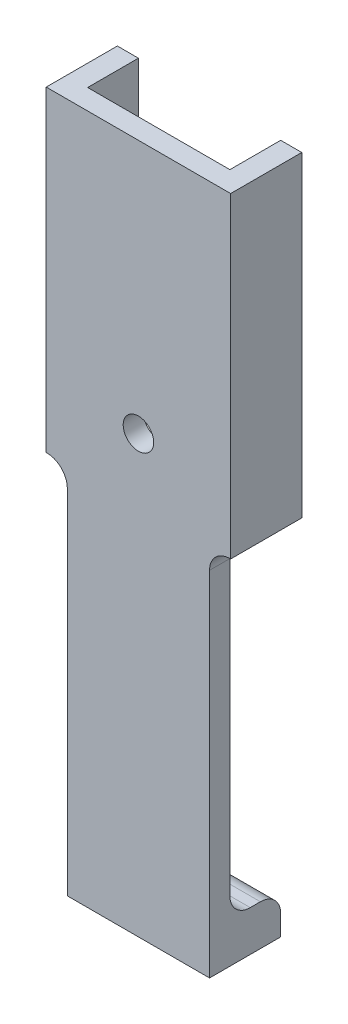
ISO-10303-21;
HEADER;
FILE_DESCRIPTION(('STEP AP214'),'2;1');
FILE_NAME('part.step','',(''),(''),'','','');
FILE_SCHEMA(('AUTOMOTIVE_DESIGN { 1 0 10303 214 1 1 1 1 }'));
ENDSEC;
DATA;
#1=APPLICATION_CONTEXT('core data for automotive mechanical design processes');
#2=APPLICATION_PROTOCOL_DEFINITION('international standard','automotive_design',2000,#1);
#3=PRODUCT_CONTEXT('',#1,'mechanical');
#4=PRODUCT('Part','Part','',(#3));
#5=PRODUCT_RELATED_PRODUCT_CATEGORY('part','',(#4));
#6=PRODUCT_DEFINITION_FORMATION('','',#4);
#7=PRODUCT_DEFINITION_CONTEXT('part definition',#1,'design');
#8=PRODUCT_DEFINITION('design','',#6,#7);
#9=PRODUCT_DEFINITION_SHAPE('','',#8);
#10=(LENGTH_UNIT() NAMED_UNIT(*) SI_UNIT(.MILLI.,.METRE.));
#11=(NAMED_UNIT(*) PLANE_ANGLE_UNIT() SI_UNIT($,.RADIAN.));
#12=(NAMED_UNIT(*) SI_UNIT($,.STERADIAN.) SOLID_ANGLE_UNIT());
#13=UNCERTAINTY_MEASURE_WITH_UNIT(LENGTH_MEASURE(1.E-05),#10,'distance_accuracy_value','');
#14=(GEOMETRIC_REPRESENTATION_CONTEXT(3) GLOBAL_UNCERTAINTY_ASSIGNED_CONTEXT((#13)) GLOBAL_UNIT_ASSIGNED_CONTEXT((#10,
#11,#12)) REPRESENTATION_CONTEXT('',''));
#15=CARTESIAN_POINT('',(0.,0.,0.));
#16=DIRECTION('',(0.,0.,1.));
#17=DIRECTION('',(1.,0.,0.));
#18=AXIS2_PLACEMENT_3D('',#15,#16,#17);
#19=CARTESIAN_POINT('',(-7.,0.,2.));
#20=DIRECTION('',(1.,0.,0.));
#21=DIRECTION('',(0.,1.,0.));
#22=AXIS2_PLACEMENT_3D('',#19,#20,#21);
#23=PLANE('',#22);
#24=DIRECTION('',(0.,-1.,0.));
#25=VECTOR('',#24,1.);
#26=CARTESIAN_POINT('',(-7.,0.,2.));
#27=LINE('',#26,#25);
#28=CARTESIAN_POINT('',(-7.,-17.65,2.));
#29=VERTEX_POINT('',#28);
#30=CARTESIAN_POINT('',(-7.,-52.4,2.));
#31=VERTEX_POINT('',#30);
#32=EDGE_CURVE('E306',#29,#31,#27,.T.);
#33=ORIENTED_EDGE('',*,*,#32,.F.);
#34=DIRECTION('',(0.,0.,1.));
#35=VECTOR('',#34,1.);
#36=CARTESIAN_POINT('',(-7.,-17.65,0.));
#37=LINE('',#36,#35);
#38=CARTESIAN_POINT('',(-7.,-17.65,0.));
#39=VERTEX_POINT('',#38);
#40=EDGE_CURVE('E364',#29,#39,#37,.F.);
#41=ORIENTED_EDGE('',*,*,#40,.T.);
#42=DIRECTION('',(0.,-1.,0.));
#43=VECTOR('',#42,1.);
#44=CARTESIAN_POINT('',(-7.,0.,0.));
#45=LINE('',#44,#43);
#46=CARTESIAN_POINT('',(-7.00000000000001,-46.4,0.));
#47=VERTEX_POINT('',#46);
#48=EDGE_CURVE('E325',#39,#47,#45,.T.);
#49=ORIENTED_EDGE('',*,*,#48,.T.);
#50=CARTESIAN_POINT('',(-7.00000000000001,-46.4,-2.));
#51=DIRECTION('',(1.,0.,0.));
#52=DIRECTION('',(0.,1.,0.));
#53=AXIS2_PLACEMENT_3D('',#50,#51,#52);
#54=CIRCLE('',#53,2.);
#55=CARTESIAN_POINT('',(-7.,-48.4,-2.));
#56=VERTEX_POINT('',#55);
#57=EDGE_CURVE('E11',#47,#56,#54,.T.);
#58=ORIENTED_EDGE('',*,*,#57,.T.);
#59=DIRECTION('',(0.,0.,1.));
#60=VECTOR('',#59,1.);
#61=CARTESIAN_POINT('',(-7.,-48.4,-5.));
#62=LINE('',#61,#60);
#63=CARTESIAN_POINT('',(-7.,-48.4,-3.));
#64=VERTEX_POINT('',#63);
#65=EDGE_CURVE('E299',#64,#56,#62,.T.);
#66=ORIENTED_EDGE('',*,*,#65,.F.);
#67=CARTESIAN_POINT('',(-7.00000000000001,-50.4,-3.));
#68=DIRECTION('',(1.,0.,0.));
#69=DIRECTION('',(0.,1.,0.));
#70=AXIS2_PLACEMENT_3D('',#67,#68,#69);
#71=CIRCLE('',#70,2.);
#72=CARTESIAN_POINT('',(-7.,-50.4,-5.));
#73=VERTEX_POINT('',#72);
#74=EDGE_CURVE('E361',#64,#73,#71,.F.);
#75=ORIENTED_EDGE('',*,*,#74,.T.);
#76=DIRECTION('',(0.,1.,0.));
#77=VECTOR('',#76,1.);
#78=CARTESIAN_POINT('',(-7.,-48.4,-5.));
#79=LINE('',#78,#77);
#80=CARTESIAN_POINT('',(-7.,-52.4,-5.));
#81=VERTEX_POINT('',#80);
#82=EDGE_CURVE('E291',#81,#73,#79,.T.);
#83=ORIENTED_EDGE('',*,*,#82,.F.);
#84=DIRECTION('',(0.,0.,-1.));
#85=VECTOR('',#84,1.);
#86=CARTESIAN_POINT('',(-7.,-52.4,2.));
#87=LINE('',#86,#85);
#88=EDGE_CURVE('E341',#31,#81,#87,.T.);
#89=ORIENTED_EDGE('',*,*,#88,.F.);
#90=EDGE_LOOP('',(#33,#41,#49,#58,#66,#75,#83,#89));
#91=FACE_BOUND('',#90,.T.);
#92=ADVANCED_FACE('F44',(#91),#23,.F.);
#93=CARTESIAN_POINT('',(7.,0.,2.));
#94=DIRECTION('',(-1.,0.,0.));
#95=DIRECTION('',(0.,-1.,0.));
#96=AXIS2_PLACEMENT_3D('',#93,#94,#95);
#97=PLANE('',#96);
#98=DIRECTION('',(0.,1.,0.));
#99=VECTOR('',#98,1.);
#100=CARTESIAN_POINT('',(7.,0.,0.));
#101=LINE('',#100,#99);
#102=CARTESIAN_POINT('',(6.99999999999999,-46.4,0.));
#103=VERTEX_POINT('',#102);
#104=CARTESIAN_POINT('',(7.,-17.65,0.));
#105=VERTEX_POINT('',#104);
#106=EDGE_CURVE('E331',#103,#105,#101,.T.);
#107=ORIENTED_EDGE('',*,*,#106,.T.);
#108=DIRECTION('',(0.,0.,-1.));
#109=VECTOR('',#108,1.);
#110=CARTESIAN_POINT('',(7.,-17.65,2.));
#111=LINE('',#110,#109);
#112=CARTESIAN_POINT('',(7.,-17.65,2.));
#113=VERTEX_POINT('',#112);
#114=EDGE_CURVE('E354',#105,#113,#111,.F.);
#115=ORIENTED_EDGE('',*,*,#114,.T.);
#116=DIRECTION('',(0.,1.,0.));
#117=VECTOR('',#116,1.);
#118=CARTESIAN_POINT('',(7.,0.,2.));
#119=LINE('',#118,#117);
#120=CARTESIAN_POINT('',(7.00000000000001,-52.4,2.));
#121=VERTEX_POINT('',#120);
#122=EDGE_CURVE('E313',#121,#113,#119,.T.);
#123=ORIENTED_EDGE('',*,*,#122,.F.);
#124=DIRECTION('',(0.,0.,-1.));
#125=VECTOR('',#124,1.);
#126=CARTESIAN_POINT('',(7.00000000000001,-52.4,2.));
#127=LINE('',#126,#125);
#128=CARTESIAN_POINT('',(7.00000000000001,-52.4,-5.));
#129=VERTEX_POINT('',#128);
#130=EDGE_CURVE('E321',#121,#129,#127,.T.);
#131=ORIENTED_EDGE('',*,*,#130,.T.);
#132=DIRECTION('',(0.,-1.,0.));
#133=VECTOR('',#132,1.);
#134=CARTESIAN_POINT('',(7.00000000000001,-48.4,-5.));
#135=LINE('',#134,#133);
#136=CARTESIAN_POINT('',(7.00000000000001,-50.4,-5.));
#137=VERTEX_POINT('',#136);
#138=EDGE_CURVE('E279',#137,#129,#135,.T.);
#139=ORIENTED_EDGE('',*,*,#138,.F.);
#140=CARTESIAN_POINT('',(6.99999999999999,-50.4,-3.));
#141=DIRECTION('',(-1.,0.,0.));
#142=DIRECTION('',(0.,-1.,0.));
#143=AXIS2_PLACEMENT_3D('',#140,#141,#142);
#144=CIRCLE('',#143,2.);
#145=CARTESIAN_POINT('',(7.00000000000001,-48.4,-3.));
#146=VERTEX_POINT('',#145);
#147=EDGE_CURVE('E351',#137,#146,#144,.F.);
#148=ORIENTED_EDGE('',*,*,#147,.T.);
#149=DIRECTION('',(0.,0.,1.));
#150=VECTOR('',#149,1.);
#151=CARTESIAN_POINT('',(7.00000000000001,-48.4,-5.));
#152=LINE('',#151,#150);
#153=CARTESIAN_POINT('',(7.00000000000001,-48.4,-2.));
#154=VERTEX_POINT('',#153);
#155=EDGE_CURVE('E295',#146,#154,#152,.T.);
#156=ORIENTED_EDGE('',*,*,#155,.T.);
#157=CARTESIAN_POINT('',(6.99999999999999,-46.4,-2.));
#158=DIRECTION('',(-1.,0.,0.));
#159=DIRECTION('',(0.,-1.,0.));
#160=AXIS2_PLACEMENT_3D('',#157,#158,#159);
#161=CIRCLE('',#160,2.);
#162=EDGE_CURVE('E54',#154,#103,#161,.T.);
#163=ORIENTED_EDGE('',*,*,#162,.T.);
#164=EDGE_LOOP('',(#107,#115,#123,#131,#139,#148,#156,#163));
#165=FACE_BOUND('',#164,.T.);
#166=ADVANCED_FACE('F444',(#165),#97,.F.);
#167=CARTESIAN_POINT('',(0.,-52.4,2.));
#168=DIRECTION('',(0.,1.,0.));
#169=DIRECTION('',(0.,0.,1.));
#170=AXIS2_PLACEMENT_3D('',#167,#168,#169);
#171=PLANE('',#170);
#172=ORIENTED_EDGE('',*,*,#88,.T.);
#173=DIRECTION('',(-1.,0.,0.));
#174=VECTOR('',#173,1.);
#175=CARTESIAN_POINT('',(7.00000000000001,-52.4,-5.));
#176=LINE('',#175,#174);
#177=EDGE_CURVE('E287',#129,#81,#176,.T.);
#178=ORIENTED_EDGE('',*,*,#177,.F.);
#179=ORIENTED_EDGE('',*,*,#130,.F.);
#180=DIRECTION('',(1.,0.,0.));
#181=VECTOR('',#180,1.);
#182=CARTESIAN_POINT('',(0.,-52.4,2.));
#183=LINE('',#182,#181);
#184=EDGE_CURVE('E310',#31,#121,#183,.T.);
#185=ORIENTED_EDGE('',*,*,#184,.F.);
#186=EDGE_LOOP('',(#172,#178,#179,#185));
#187=FACE_BOUND('',#186,.T.);
#188=CARTESIAN_POINT('',(3.5,-52.4,-1.5));
#189=DIRECTION('',(0.,-1.,0.));
#190=DIRECTION('',(0.,0.,-1.));
#191=AXIS2_PLACEMENT_3D('',#188,#189,#190);
#192=CIRCLE('',#191,1.);
#193=CARTESIAN_POINT('',(3.5,-52.4,-2.5));
#194=VERTEX_POINT('',#193);
#195=EDGE_CURVE('E260',#194,#194,#192,.F.);
#196=ORIENTED_EDGE('',*,*,#195,.T.);
#197=EDGE_LOOP('',(#196));
#198=FACE_BOUND('',#197,.T.);
#199=CARTESIAN_POINT('',(-3.5,-52.4,-1.5));
#200=DIRECTION('',(0.,-1.,0.));
#201=DIRECTION('',(0.,0.,-1.));
#202=AXIS2_PLACEMENT_3D('',#199,#200,#201);
#203=CIRCLE('',#202,1.);
#204=CARTESIAN_POINT('',(-3.5,-52.4,-2.5));
#205=VERTEX_POINT('',#204);
#206=EDGE_CURVE('E271',#205,#205,#203,.T.);
#207=ORIENTED_EDGE('',*,*,#206,.F.);
#208=EDGE_LOOP('',(#207));
#209=FACE_BOUND('',#208,.T.);
#210=ADVANCED_FACE('F432',(#187,#198,#209),#171,.F.);
#211=CARTESIAN_POINT('',(7.00000000000001,-48.4,-5.));
#212=DIRECTION('',(0.,-1.,0.));
#213=DIRECTION('',(0.,0.,-1.));
#214=AXIS2_PLACEMENT_3D('',#211,#212,#213);
#215=PLANE('',#214);
#216=ORIENTED_EDGE('',*,*,#155,.F.);
#217=DIRECTION('',(1.,0.,0.));
#218=VECTOR('',#217,1.);
#219=CARTESIAN_POINT('',(-7.,-48.4,-3.));
#220=LINE('',#219,#218);
#221=EDGE_CURVE('E381',#146,#64,#220,.F.);
#222=ORIENTED_EDGE('',*,*,#221,.T.);
#223=ORIENTED_EDGE('',*,*,#65,.T.);
#224=DIRECTION('',(1.,0.,0.));
#225=VECTOR('',#224,1.);
#226=CARTESIAN_POINT('',(7.00000000000001,-48.4,-2.));
#227=LINE('',#226,#225);
#228=CARTESIAN_POINT('',(-4.36602540378444,-48.4,-2.));
#229=VERTEX_POINT('',#228);
#230=EDGE_CURVE('E377',#56,#229,#227,.T.);
#231=ORIENTED_EDGE('',*,*,#230,.T.);
#232=CARTESIAN_POINT('',(-3.5,-48.4,-1.5));
#233=DIRECTION('',(0.,-1.,0.));
#234=DIRECTION('',(0.,0.,-1.));
#235=AXIS2_PLACEMENT_3D('',#232,#233,#234);
#236=CIRCLE('',#235,1.);
#237=CARTESIAN_POINT('',(-2.63397459621556,-48.4,-2.));
#238=VERTEX_POINT('',#237);
#239=EDGE_CURVE('E275',#238,#229,#236,.F.);
#240=ORIENTED_EDGE('',*,*,#239,.F.);
#241=DIRECTION('',(1.,0.,0.));
#242=VECTOR('',#241,1.);
#243=CARTESIAN_POINT('',(7.00000000000001,-48.4,-2.));
#244=LINE('',#243,#242);
#245=CARTESIAN_POINT('',(2.63397459621556,-48.4,-2.));
#246=VERTEX_POINT('',#245);
#247=EDGE_CURVE('E374',#238,#246,#244,.T.);
#248=ORIENTED_EDGE('',*,*,#247,.T.);
#249=CARTESIAN_POINT('',(3.5,-48.4,-1.5));
#250=DIRECTION('',(0.,-1.,0.));
#251=DIRECTION('',(0.,0.,-1.));
#252=AXIS2_PLACEMENT_3D('',#249,#250,#251);
#253=CIRCLE('',#252,1.);
#254=CARTESIAN_POINT('',(4.36602540378444,-48.4,-2.));
#255=VERTEX_POINT('',#254);
#256=EDGE_CURVE('E276',#246,#255,#253,.T.);
#257=ORIENTED_EDGE('',*,*,#256,.T.);
#258=DIRECTION('',(1.,0.,0.));
#259=VECTOR('',#258,1.);
#260=CARTESIAN_POINT('',(7.00000000000001,-48.4,-2.));
#261=LINE('',#260,#259);
#262=EDGE_CURVE('E371',#255,#154,#261,.T.);
#263=ORIENTED_EDGE('',*,*,#262,.T.);
#264=EDGE_LOOP('',(#216,#222,#223,#231,#240,#248,#257,#263));
#265=FACE_BOUND('',#264,.T.);
#266=ADVANCED_FACE('F428',(#265),#215,.F.);
#267=CARTESIAN_POINT('',(0.,0.,0.));
#268=DIRECTION('',(0.,0.,1.));
#269=DIRECTION('',(1.,0.,0.));
#270=AXIS2_PLACEMENT_3D('',#267,#268,#269);
#271=PLANE('',#270);
#272=CARTESIAN_POINT('',(0.,-9.5,0.));
#273=DIRECTION('',(0.,0.,1.));
#274=DIRECTION('',(1.,0.,0.));
#275=AXIS2_PLACEMENT_3D('',#272,#273,#274);
#276=CIRCLE('',#275,1.5);
#277=CARTESIAN_POINT('',(1.5,-9.5,0.));
#278=VERTEX_POINT('',#277);
#279=EDGE_CURVE('E307',#278,#278,#276,.T.);
#280=ORIENTED_EDGE('',*,*,#279,.T.);
#281=EDGE_LOOP('',(#280));
#282=FACE_BOUND('',#281,.T.);
#283=ORIENTED_EDGE('',*,*,#106,.F.);
#284=DIRECTION('',(1.,0.,0.));
#285=VECTOR('',#284,1.);
#286=CARTESIAN_POINT('',(-7.00000000000001,-46.4,0.));
#287=LINE('',#286,#285);
#288=EDGE_CURVE('E384',#103,#47,#287,.F.);
#289=ORIENTED_EDGE('',*,*,#288,.T.);
#290=ORIENTED_EDGE('',*,*,#48,.F.);
#291=CARTESIAN_POINT('',(-9.,-17.65,0.));
#292=DIRECTION('',(0.,0.,1.));
#293=DIRECTION('',(1.,0.,0.));
#294=AXIS2_PLACEMENT_3D('',#291,#292,#293);
#295=CIRCLE('',#294,2.);
#296=CARTESIAN_POINT('',(-9.,-15.65,0.));
#297=VERTEX_POINT('',#296);
#298=EDGE_CURVE('E396',#39,#297,#295,.T.);
#299=ORIENTED_EDGE('',*,*,#298,.T.);
#300=DIRECTION('',(-1.,0.,0.));
#301=VECTOR('',#300,1.);
#302=CARTESIAN_POINT('',(0.,-15.65,0.));
#303=LINE('',#302,#301);
#304=CARTESIAN_POINT('',(-7.,-15.65,0.));
#305=VERTEX_POINT('',#304);
#306=EDGE_CURVE('E61',#305,#297,#303,.T.);
#307=ORIENTED_EDGE('',*,*,#306,.F.);
#308=CARTESIAN_POINT('',(-7.,15.5,0.));
#309=VERTEX_POINT('',#308);
#310=EDGE_CURVE('E326',#309,#305,#45,.T.);
#311=ORIENTED_EDGE('',*,*,#310,.F.);
#312=DIRECTION('',(-1.,0.,0.));
#313=VECTOR('',#312,1.);
#314=CARTESIAN_POINT('',(0.,15.5,0.));
#315=LINE('',#314,#313);
#316=CARTESIAN_POINT('',(7.,15.5,0.));
#317=VERTEX_POINT('',#316);
#318=EDGE_CURVE('E303',#317,#309,#315,.T.);
#319=ORIENTED_EDGE('',*,*,#318,.F.);
#320=CARTESIAN_POINT('',(7.,-15.65,0.));
#321=VERTEX_POINT('',#320);
#322=EDGE_CURVE('E330',#321,#317,#101,.T.);
#323=ORIENTED_EDGE('',*,*,#322,.F.);
#324=DIRECTION('',(-1.,0.,0.));
#325=VECTOR('',#324,1.);
#326=CARTESIAN_POINT('',(0.,-15.65,0.));
#327=LINE('',#326,#325);
#328=CARTESIAN_POINT('',(9.,-15.65,0.));
#329=VERTEX_POINT('',#328);
#330=EDGE_CURVE('E344',#329,#321,#327,.T.);
#331=ORIENTED_EDGE('',*,*,#330,.F.);
#332=CARTESIAN_POINT('',(9.,-17.65,0.));
#333=DIRECTION('',(0.,0.,1.));
#334=DIRECTION('',(1.,0.,0.));
#335=AXIS2_PLACEMENT_3D('',#332,#333,#334);
#336=CIRCLE('',#335,2.);
#337=EDGE_CURVE('E387',#329,#105,#336,.T.);
#338=ORIENTED_EDGE('',*,*,#337,.T.);
#339=EDGE_LOOP('',(#283,#289,#290,#299,#307,#311,#319,#323,#331,#338));
#340=FACE_BOUND('',#339,.T.);
#341=ADVANCED_FACE('F431',(#282,#340),#271,.F.);
#342=CARTESIAN_POINT('',(0.,15.5,2.));
#343=DIRECTION('',(0.,-1.,0.));
#344=DIRECTION('',(1.,0.,0.));
#345=AXIS2_PLACEMENT_3D('',#342,#343,#344);
#346=PLANE('',#345);
#347=ORIENTED_EDGE('',*,*,#318,.T.);
#348=DIRECTION('',(0.,0.,1.));
#349=VECTOR('',#348,1.);
#350=CARTESIAN_POINT('',(-7.,15.5,-5.));
#351=LINE('',#350,#349);
#352=CARTESIAN_POINT('',(-7.,15.5,-5.));
#353=VERTEX_POINT('',#352);
#354=EDGE_CURVE('E229',#353,#309,#351,.T.);
#355=ORIENTED_EDGE('',*,*,#354,.F.);
#356=DIRECTION('',(-1.,0.,0.));
#357=VECTOR('',#356,1.);
#358=CARTESIAN_POINT('',(0.,15.5,-5.));
#359=LINE('',#358,#357);
#360=CARTESIAN_POINT('',(-9.075,15.5,-5.));
#361=VERTEX_POINT('',#360);
#362=EDGE_CURVE('E215',#353,#361,#359,.T.);
#363=ORIENTED_EDGE('',*,*,#362,.T.);
#364=DIRECTION('',(0.,0.,1.));
#365=VECTOR('',#364,1.);
#366=CARTESIAN_POINT('',(-9.075,15.5,-5.));
#367=LINE('',#366,#365);
#368=CARTESIAN_POINT('',(-9.075,15.5,2.));
#369=VERTEX_POINT('',#368);
#370=EDGE_CURVE('E233',#361,#369,#367,.T.);
#371=ORIENTED_EDGE('',*,*,#370,.T.);
#372=DIRECTION('',(-1.,0.,0.));
#373=VECTOR('',#372,1.);
#374=CARTESIAN_POINT('',(0.,15.5,2.));
#375=LINE('',#374,#373);
#376=CARTESIAN_POINT('',(9.075,15.5,2.));
#377=VERTEX_POINT('',#376);
#378=EDGE_CURVE('E208',#377,#369,#375,.T.);
#379=ORIENTED_EDGE('',*,*,#378,.F.);
#380=DIRECTION('',(0.,0.,-1.));
#381=VECTOR('',#380,1.);
#382=CARTESIAN_POINT('',(9.075,15.5,33.2190346583619));
#383=LINE('',#382,#381);
#384=CARTESIAN_POINT('',(9.075,15.5,-5.));
#385=VERTEX_POINT('',#384);
#386=EDGE_CURVE('E264',#377,#385,#383,.T.);
#387=ORIENTED_EDGE('',*,*,#386,.T.);
#388=DIRECTION('',(1.,0.,0.));
#389=VECTOR('',#388,1.);
#390=CARTESIAN_POINT('',(0.,15.5,-5.));
#391=LINE('',#390,#389);
#392=CARTESIAN_POINT('',(7.,15.5,-5.));
#393=VERTEX_POINT('',#392);
#394=EDGE_CURVE('E243',#393,#385,#391,.T.);
#395=ORIENTED_EDGE('',*,*,#394,.F.);
#396=DIRECTION('',(0.,0.,-1.));
#397=VECTOR('',#396,1.);
#398=CARTESIAN_POINT('',(7.,15.5,33.2190346583619));
#399=LINE('',#398,#397);
#400=EDGE_CURVE('E261',#317,#393,#399,.T.);
#401=ORIENTED_EDGE('',*,*,#400,.F.);
#402=EDGE_LOOP('',(#347,#355,#363,#371,#379,#387,#395,#401));
#403=FACE_BOUND('',#402,.T.);
#404=ADVANCED_FACE('F439',(#403),#346,.F.);
#405=CARTESIAN_POINT('',(0.,-9.5,2.));
#406=DIRECTION('',(0.,0.,-1.));
#407=DIRECTION('',(-1.,0.,0.));
#408=AXIS2_PLACEMENT_3D('',#405,#406,#407);
#409=CYLINDRICAL_SURFACE('',#408,1.5);
#410=CARTESIAN_POINT('',(0.,-9.5,2.));
#411=DIRECTION('',(0.,0.,1.));
#412=DIRECTION('',(1.,0.,0.));
#413=AXIS2_PLACEMENT_3D('',#410,#411,#412);
#414=CIRCLE('',#413,1.5);
#415=CARTESIAN_POINT('',(1.5,-9.5,2.));
#416=VERTEX_POINT('',#415);
#417=EDGE_CURVE('E317',#416,#416,#414,.T.);
#418=ORIENTED_EDGE('',*,*,#417,.T.);
#419=EDGE_LOOP('',(#418));
#420=FACE_BOUND('',#419,.T.);
#421=ORIENTED_EDGE('',*,*,#279,.F.);
#422=EDGE_LOOP('',(#421));
#423=FACE_BOUND('',#422,.T.);
#424=ADVANCED_FACE('F436',(#420,#423),#409,.F.);
#425=CARTESIAN_POINT('',(0.,0.,2.));
#426=DIRECTION('',(0.,0.,1.));
#427=DIRECTION('',(1.,0.,0.));
#428=AXIS2_PLACEMENT_3D('',#425,#426,#427);
#429=PLANE('',#428);
#430=ORIENTED_EDGE('',*,*,#378,.T.);
#431=DIRECTION('',(0.,-1.,0.));
#432=VECTOR('',#431,1.);
#433=CARTESIAN_POINT('',(-9.075,0.,2.));
#434=LINE('',#433,#432);
#435=CARTESIAN_POINT('',(-9.075,-15.65,2.));
#436=VERTEX_POINT('',#435);
#437=EDGE_CURVE('E194',#369,#436,#434,.T.);
#438=ORIENTED_EDGE('',*,*,#437,.T.);
#439=DIRECTION('',(-1.,0.,0.));
#440=VECTOR('',#439,1.);
#441=CARTESIAN_POINT('',(0.,-15.65,2.));
#442=LINE('',#441,#440);
#443=CARTESIAN_POINT('',(-9.,-15.65,2.));
#444=VERTEX_POINT('',#443);
#445=EDGE_CURVE('E183',#444,#436,#442,.T.);
#446=ORIENTED_EDGE('',*,*,#445,.F.);
#447=CARTESIAN_POINT('',(-9.,-17.65,2.));
#448=DIRECTION('',(0.,0.,1.));
#449=DIRECTION('',(1.,0.,0.));
#450=AXIS2_PLACEMENT_3D('',#447,#448,#449);
#451=CIRCLE('',#450,2.);
#452=EDGE_CURVE('E393',#444,#29,#451,.F.);
#453=ORIENTED_EDGE('',*,*,#452,.T.);
#454=ORIENTED_EDGE('',*,*,#32,.T.);
#455=ORIENTED_EDGE('',*,*,#184,.T.);
#456=ORIENTED_EDGE('',*,*,#122,.T.);
#457=CARTESIAN_POINT('',(9.,-17.65,2.));
#458=DIRECTION('',(0.,0.,1.));
#459=DIRECTION('',(1.,0.,0.));
#460=AXIS2_PLACEMENT_3D('',#457,#458,#459);
#461=CIRCLE('',#460,2.);
#462=CARTESIAN_POINT('',(9.,-15.65,2.));
#463=VERTEX_POINT('',#462);
#464=EDGE_CURVE('E390',#113,#463,#461,.F.);
#465=ORIENTED_EDGE('',*,*,#464,.T.);
#466=DIRECTION('',(1.,0.,0.));
#467=VECTOR('',#466,1.);
#468=CARTESIAN_POINT('',(0.,-15.65,2.));
#469=LINE('',#468,#467);
#470=CARTESIAN_POINT('',(9.075,-15.65,2.));
#471=VERTEX_POINT('',#470);
#472=EDGE_CURVE('E257',#463,#471,#469,.T.);
#473=ORIENTED_EDGE('',*,*,#472,.T.);
#474=DIRECTION('',(0.,-1.,0.));
#475=VECTOR('',#474,1.);
#476=CARTESIAN_POINT('',(9.075,0.,2.));
#477=LINE('',#476,#475);
#478=EDGE_CURVE('E252',#377,#471,#477,.T.);
#479=ORIENTED_EDGE('',*,*,#478,.F.);
#480=EDGE_LOOP('',(#430,#438,#446,#453,#454,#455,#456,#465,#473,#479));
#481=FACE_BOUND('',#480,.T.);
#482=ORIENTED_EDGE('',*,*,#417,.F.);
#483=EDGE_LOOP('',(#482));
#484=FACE_BOUND('',#483,.T.);
#485=ADVANCED_FACE('F205',(#481,#484),#429,.T.);
#486=CARTESIAN_POINT('',(0.,0.,-5.));
#487=DIRECTION('',(0.,0.,-1.));
#488=DIRECTION('',(-1.,0.,0.));
#489=AXIS2_PLACEMENT_3D('',#486,#487,#488);
#490=PLANE('',#489);
#491=ORIENTED_EDGE('',*,*,#82,.T.);
#492=DIRECTION('',(1.,0.,0.));
#493=VECTOR('',#492,1.);
#494=CARTESIAN_POINT('',(7.00000000000001,-50.4,-5.));
#495=LINE('',#494,#493);
#496=EDGE_CURVE('E367',#73,#137,#495,.T.);
#497=ORIENTED_EDGE('',*,*,#496,.T.);
#498=ORIENTED_EDGE('',*,*,#138,.T.);
#499=ORIENTED_EDGE('',*,*,#177,.T.);
#500=EDGE_LOOP('',(#491,#497,#498,#499));
#501=FACE_BOUND('',#500,.T.);
#502=ADVANCED_FACE('F423',(#501),#490,.T.);
#503=CARTESIAN_POINT('',(3.5,-45.5715728752538,-1.5));
#504=DIRECTION('',(0.,-1.,0.));
#505=DIRECTION('',(0.,0.,-1.));
#506=AXIS2_PLACEMENT_3D('',#503,#504,#505);
#507=CYLINDRICAL_SURFACE('',#506,1.);
#508=ORIENTED_EDGE('',*,*,#256,.F.);
#509=CARTESIAN_POINT('',(2.63397459621556,-48.4,-2.));
#510=CARTESIAN_POINT('',(2.62106375856024,-48.4000010757173,-1.97763903731866));
#511=CARTESIAN_POINT('',(2.60902584835808,-48.3996244043409,-1.95478569817508));
#512=CARTESIAN_POINT('',(2.58676051551341,-48.3980296589214,-1.90823988389377));
#513=CARTESIAN_POINT('',(2.57653324438274,-48.3968115145067,-1.8845473387313));
#514=CARTESIAN_POINT('',(2.54872794805303,-48.3917770370597,-1.81259183973402));
#515=CARTESIAN_POINT('',(2.53394143454517,-48.3865817672421,-1.7633032718799));
#516=CARTESIAN_POINT('',(2.5121468213131,-48.3721474056253,-1.66357950975317));
#517=CARTESIAN_POINT('',(2.50514773063196,-48.3629036474332,-1.6131430561853));
#518=CARTESIAN_POINT('',(2.4988152982575,-48.3404089510902,-1.51269977322653));
#519=CARTESIAN_POINT('',(2.49948147138893,-48.3271582666105,-1.46269291684465));
#520=CARTESIAN_POINT('',(2.50804324648776,-48.2968843934397,-1.36397933107001));
#521=CARTESIAN_POINT('',(2.51600707992737,-48.2798267511482,-1.31528934517188));
#522=CARTESIAN_POINT('',(2.53856190888715,-48.2426317260722,-1.22070830166604));
#523=CARTESIAN_POINT('',(2.55315639823852,-48.2224927233695,-1.17481873413567));
#524=CARTESIAN_POINT('',(2.59030876706899,-48.1773721499222,-1.08133324604492));
#525=CARTESIAN_POINT('',(2.61360136120172,-48.1520996093918,-1.03417141693121));
#526=CARTESIAN_POINT('',(2.66669284266612,-48.099743459112,-0.944744853667942));
#527=CARTESIAN_POINT('',(2.69649834111774,-48.0726580286558,-0.902485162798666));
#528=CARTESIAN_POINT('',(2.76744884894565,-48.0133298109963,-0.81664946144792));
#529=CARTESIAN_POINT('',(2.80965535918958,-47.9809785076303,-0.77402355236094));
#530=CARTESIAN_POINT('',(2.90163718082605,-47.9177077634535,-0.696521288906358));
#531=CARTESIAN_POINT('',(2.95140947357511,-47.8867877579646,-0.661641857399483));
#532=CARTESIAN_POINT('',(3.04310044142293,-47.8377491406219,-0.609398137757857));
#533=CARTESIAN_POINT('',(3.08318511712445,-47.8185005894742,-0.589878580680357));
#534=CARTESIAN_POINT('',(3.16705590307074,-47.7839705137087,-0.555974309496952));
#535=CARTESIAN_POINT('',(3.21083409747549,-47.7686807773155,-0.541578942631453));
#536=CARTESIAN_POINT('',(3.29288154246195,-47.7463314162909,-0.520953145750848));
#537=CARTESIAN_POINT('',(3.3306083905832,-47.7382581508624,-0.513688956547802));
#538=CARTESIAN_POINT('',(3.40734820066874,-47.7269151508669,-0.503552041096994));
#539=CARTESIAN_POINT('',(3.44635966458963,-47.7236400106184,-0.500674372742729));
#540=CARTESIAN_POINT('',(3.52463203022906,-47.7223498304191,-0.499536007375441));
#541=CARTESIAN_POINT('',(3.56389329992101,-47.7243469542934,-0.501285986986986));
#542=CARTESIAN_POINT('',(3.64137854209852,-47.7333325888703,-0.509276032238689));
#543=CARTESIAN_POINT('',(3.67960141244697,-47.7403262031985,-0.515520688979961));
#544=CARTESIAN_POINT('',(3.76344653707658,-47.7606997785071,-0.534145985512239));
#545=CARTESIAN_POINT('',(3.80852628891271,-47.7752400673845,-0.547671208410422));
#546=CARTESIAN_POINT('',(3.89495303497059,-47.8087304123663,-0.580133051992105));
#547=CARTESIAN_POINT('',(3.93629098145638,-47.8276907806208,-0.599082351100851));
#548=CARTESIAN_POINT('',(4.02994037445424,-47.8759351574058,-0.649722386173165));
#549=CARTESIAN_POINT('',(4.08049244675152,-47.9064122053107,-0.683521769049864));
#550=CARTESIAN_POINT('',(4.17411178388987,-47.9691247875754,-0.75892623189745));
#551=CARTESIAN_POINT('',(4.2171711751546,-48.0013621255459,-0.800539428598495));
#552=CARTESIAN_POINT('',(4.29611140441053,-48.0658541970963,-0.891799742813555));
#553=CARTESIAN_POINT('',(4.33185154570396,-48.0980991200528,-0.941576133943536));
#554=CARTESIAN_POINT('',(4.39414035673004,-48.1599645978982,-1.04800218079238));
#555=CARTESIAN_POINT('',(4.42070197973312,-48.1895888069723,-1.10464199659623));
#556=CARTESIAN_POINT('',(4.45929925883574,-48.239395371021,-1.21291485874139));
#557=CARTESIAN_POINT('',(4.47310036404688,-48.2603144392533,-1.26357800321027));
#558=CARTESIAN_POINT('',(4.49264233192455,-48.2982720356707,-1.36783596604713));
#559=CARTESIAN_POINT('',(4.49838942720931,-48.3153135559427,-1.42142848410279));
#560=CARTESIAN_POINT('',(4.50102991643133,-48.3449061278952,-1.53038066097913));
#561=CARTESIAN_POINT('',(4.4978769561685,-48.3574332847797,-1.58574808142779));
#562=CARTESIAN_POINT('',(4.4821687147655,-48.3775646736088,-1.69606595631295));
#563=CARTESIAN_POINT('',(4.46961644783684,-48.385170482296,-1.75101653871772));
#564=CARTESIAN_POINT('',(4.44161448835227,-48.3937679966936,-1.83857689083464));
#565=CARTESIAN_POINT('',(4.42893060168377,-48.396163656048,-1.87196693662511));
#566=CARTESIAN_POINT('',(4.40006201082559,-48.3992826207785,-1.93722155587376));
#567=CARTESIAN_POINT('',(4.38388250697873,-48.4000083919199,-1.96908831040564));
#568=CARTESIAN_POINT('',(4.36602540378444,-48.4,-2.));
#569=B_SPLINE_CURVE_WITH_KNOTS('',3,(#509,#510,#511,#512,#513,#514,#515,#516,#517,#518,#519,
#520,#521,#522,#523,#524,#525,#526,#527,#528,#529,#530,#531,#532,#533,#534,#535,#536,#537,#538,
#539,#540,#541,#542,#543,#544,#545,#546,#547,#548,#549,#550,#551,#552,#553,#554,#555,#556,#557,
#558,#559,#560,#561,#562,#563,#564,#565,#566,#567,#568),.UNSPECIFIED.,.F.,.F.,(4,2,2,2,2,2,2,2,
2,2,2,2,2,2,2,2,2,2,2,2,2,2,2,2,2,2,2,2,2,4),(0.,0.0774181834231539,0.154842842036823,
0.309187329970408,0.463710189497364,0.618223268505891,0.774195915055119,0.930250842340239,
1.10465983581664,1.27924669769439,1.48287125250379,1.68641477612525,1.83165648641124,
1.97659446328669,2.09388112822247,2.2110355533371,2.32846050561697,2.44600557248675,
2.59297118769646,2.74028317061284,2.94328508372795,3.14649904688069,3.35331331136315,
3.55983450370974,3.72870281012693,3.89744036503364,4.06705837560235,4.23662201559422,
4.34379077628085,4.45080118918908),.UNSPECIFIED.);
#570=EDGE_CURVE('E406',#246,#255,#569,.T.);
#571=ORIENTED_EDGE('',*,*,#570,.T.);
#572=EDGE_LOOP('',(#508,#571));
#573=FACE_BOUND('',#572,.T.);
#574=ORIENTED_EDGE('',*,*,#195,.F.);
#575=EDGE_LOOP('',(#574));
#576=FACE_BOUND('',#575,.T.);
#577=ADVANCED_FACE('F417',(#573,#576),#507,.F.);
#578=CARTESIAN_POINT('',(-3.5,-45.5715728752538,-1.5));
#579=DIRECTION('',(0.,-1.,0.));
#580=DIRECTION('',(0.,0.,-1.));
#581=AXIS2_PLACEMENT_3D('',#578,#579,#580);
#582=CYLINDRICAL_SURFACE('',#581,1.);
#583=ORIENTED_EDGE('',*,*,#239,.T.);
#584=CARTESIAN_POINT('',(-4.36602540378444,-48.4,-2.));
#585=CARTESIAN_POINT('',(-4.37893624143977,-48.4000010757173,-1.97763903731866));
#586=CARTESIAN_POINT('',(-4.39097415164193,-48.3996244043409,-1.95478569817508));
#587=CARTESIAN_POINT('',(-4.41323948448659,-48.3980296589214,-1.90823988389377));
#588=CARTESIAN_POINT('',(-4.42346675561727,-48.3968115145067,-1.8845473387313));
#589=CARTESIAN_POINT('',(-4.45127205194697,-48.3917770370597,-1.81259183973402));
#590=CARTESIAN_POINT('',(-4.46605856545483,-48.3865817672421,-1.7633032718799));
#591=CARTESIAN_POINT('',(-4.4878531786869,-48.3721474056253,-1.66357950975317));
#592=CARTESIAN_POINT('',(-4.49485226936804,-48.3629036474332,-1.6131430561853));
#593=CARTESIAN_POINT('',(-4.50118470174251,-48.3404089510902,-1.51269977322653));
#594=CARTESIAN_POINT('',(-4.50051852861107,-48.3271582666105,-1.46269291684465));
#595=CARTESIAN_POINT('',(-4.49195675351224,-48.2968843934397,-1.36397933107001));
#596=CARTESIAN_POINT('',(-4.48399292007263,-48.2798267511482,-1.31528934517188));
#597=CARTESIAN_POINT('',(-4.46143809111285,-48.2426317260722,-1.22070830166604));
#598=CARTESIAN_POINT('',(-4.44684360176149,-48.2224927233695,-1.17481873413567));
#599=CARTESIAN_POINT('',(-4.40969123293101,-48.1773721499222,-1.08133324604492));
#600=CARTESIAN_POINT('',(-4.38639863879828,-48.1520996093918,-1.03417141693121));
#601=CARTESIAN_POINT('',(-4.33330715733388,-48.099743459112,-0.944744853667942));
#602=CARTESIAN_POINT('',(-4.30350165888226,-48.0726580286558,-0.902485162798666));
#603=CARTESIAN_POINT('',(-4.23255115105435,-48.0133298109963,-0.81664946144792));
#604=CARTESIAN_POINT('',(-4.19034464081042,-47.9809785076303,-0.774023552360939));
#605=CARTESIAN_POINT('',(-4.09836281917395,-47.9177077634535,-0.696521288906358));
#606=CARTESIAN_POINT('',(-4.04859052642489,-47.8867877579646,-0.661641857399483));
#607=CARTESIAN_POINT('',(-3.95689955857707,-47.8377491406219,-0.609398137757857));
#608=CARTESIAN_POINT('',(-3.91681488287555,-47.8185005894742,-0.589878580680357));
#609=CARTESIAN_POINT('',(-3.83294409692926,-47.7839705137087,-0.555974309496952));
#610=CARTESIAN_POINT('',(-3.78916590252451,-47.7686807773155,-0.541578942631453));
#611=CARTESIAN_POINT('',(-3.70711845753805,-47.7463314162909,-0.520953145750849));
#612=CARTESIAN_POINT('',(-3.6693916094168,-47.7382581508624,-0.513688956547802));
#613=CARTESIAN_POINT('',(-3.59265179933126,-47.7269151508669,-0.503552041096994));
#614=CARTESIAN_POINT('',(-3.55364033541037,-47.7236400106184,-0.500674372742729));
#615=CARTESIAN_POINT('',(-3.47536796977094,-47.7223498304191,-0.499536007375442));
#616=CARTESIAN_POINT('',(-3.43610670007899,-47.7243469542934,-0.501285986986987));
#617=CARTESIAN_POINT('',(-3.35862145790149,-47.7333325888703,-0.50927603223869));
#618=CARTESIAN_POINT('',(-3.32039858755303,-47.7403262031985,-0.515520688979961));
#619=CARTESIAN_POINT('',(-3.23655346292342,-47.7606997785071,-0.534145985512239));
#620=CARTESIAN_POINT('',(-3.19147371108729,-47.7752400673845,-0.547671208410422));
#621=CARTESIAN_POINT('',(-3.10504696502942,-47.8087304123663,-0.580133051992105));
#622=CARTESIAN_POINT('',(-3.06370901854362,-47.8276907806208,-0.599082351100851));
#623=CARTESIAN_POINT('',(-2.97005962554577,-47.8759351574058,-0.649722386173165));
#624=CARTESIAN_POINT('',(-2.91950755324848,-47.9064122053107,-0.683521769049864));
#625=CARTESIAN_POINT('',(-2.82588821611013,-47.9691247875754,-0.75892623189745));
#626=CARTESIAN_POINT('',(-2.7828288248454,-48.0013621255459,-0.800539428598495));
#627=CARTESIAN_POINT('',(-2.70388859558947,-48.0658541970963,-0.891799742813555));
#628=CARTESIAN_POINT('',(-2.66814845429604,-48.0980991200528,-0.941576133943537));
#629=CARTESIAN_POINT('',(-2.60585964326996,-48.1599645978982,-1.04800218079238));
#630=CARTESIAN_POINT('',(-2.57929802026688,-48.1895888069723,-1.10464199659623));
#631=CARTESIAN_POINT('',(-2.54070074116427,-48.239395371021,-1.21291485874139));
#632=CARTESIAN_POINT('',(-2.52689963595312,-48.2603144392533,-1.26357800321027));
#633=CARTESIAN_POINT('',(-2.50735766807545,-48.2982720356707,-1.36783596604712));
#634=CARTESIAN_POINT('',(-2.50161057279069,-48.3153135559427,-1.42142848410279));
#635=CARTESIAN_POINT('',(-2.49897008356868,-48.3449061278952,-1.53038066097913));
#636=CARTESIAN_POINT('',(-2.5021230438315,-48.3574332847797,-1.58574808142779));
#637=CARTESIAN_POINT('',(-2.5178312852345,-48.3775646736088,-1.69606595631295));
#638=CARTESIAN_POINT('',(-2.53038355216316,-48.385170482296,-1.75101653871772));
#639=CARTESIAN_POINT('',(-2.55838551164773,-48.3937679966936,-1.83857689083464));
#640=CARTESIAN_POINT('',(-2.57106939831623,-48.396163656048,-1.87196693662511));
#641=CARTESIAN_POINT('',(-2.59993798917441,-48.3992826207785,-1.93722155587376));
#642=CARTESIAN_POINT('',(-2.61611749302127,-48.4000083919199,-1.96908831040564));
#643=CARTESIAN_POINT('',(-2.63397459621556,-48.4,-2.));
#644=B_SPLINE_CURVE_WITH_KNOTS('',3,(#584,#585,#586,#587,#588,#589,#590,#591,#592,#593,#594,
#595,#596,#597,#598,#599,#600,#601,#602,#603,#604,#605,#606,#607,#608,#609,#610,#611,#612,#613,
#614,#615,#616,#617,#618,#619,#620,#621,#622,#623,#624,#625,#626,#627,#628,#629,#630,#631,#632,
#633,#634,#635,#636,#637,#638,#639,#640,#641,#642,#643),.UNSPECIFIED.,.F.,.F.,(4,2,2,2,2,2,2,2,
2,2,2,2,2,2,2,2,2,2,2,2,2,2,2,2,2,2,2,2,2,4),(0.,0.0774181834231537,0.154842842036823,
0.309187329970408,0.463710189497363,0.618223268505892,0.774195915055119,0.930250842340239,
1.10465983581664,1.27924669769439,1.48287125250379,1.68641477612525,1.83165648641124,
1.9765944632867,2.09388112822247,2.2110355533371,2.32846050561697,2.44600557248675,
2.59297118769645,2.74028317061284,2.94328508372795,3.14649904688069,3.35331331136315,
3.55983450370974,3.72870281012692,3.89744036503364,4.06705837560235,4.23662201559422,
4.34379077628085,4.45080118918908),.UNSPECIFIED.);
#645=EDGE_CURVE('E68',#229,#238,#644,.T.);
#646=ORIENTED_EDGE('',*,*,#645,.T.);
#647=EDGE_LOOP('',(#583,#646));
#648=FACE_BOUND('',#647,.T.);
#649=ORIENTED_EDGE('',*,*,#206,.T.);
#650=EDGE_LOOP('',(#649));
#651=FACE_BOUND('',#650,.T.);
#652=ADVANCED_FACE('F412',(#648,#651),#582,.F.);
#653=CARTESIAN_POINT('',(7.,0.,33.2190346583619));
#654=DIRECTION('',(1.,0.,0.));
#655=DIRECTION('',(0.,1.,0.));
#656=AXIS2_PLACEMENT_3D('',#653,#654,#655);
#657=PLANE('',#656);
#658=DIRECTION('',(0.,0.,-1.));
#659=VECTOR('',#658,1.);
#660=CARTESIAN_POINT('',(7.,-15.65,33.2190346583619));
#661=LINE('',#660,#659);
#662=CARTESIAN_POINT('',(7.,-15.65,-5.));
#663=VERTEX_POINT('',#662);
#664=EDGE_CURVE('E251',#321,#663,#661,.T.);
#665=ORIENTED_EDGE('',*,*,#664,.F.);
#666=ORIENTED_EDGE('',*,*,#322,.T.);
#667=ORIENTED_EDGE('',*,*,#400,.T.);
#668=DIRECTION('',(0.,-1.,0.));
#669=VECTOR('',#668,1.);
#670=CARTESIAN_POINT('',(7.,0.,-5.));
#671=LINE('',#670,#669);
#672=EDGE_CURVE('E239',#393,#663,#671,.T.);
#673=ORIENTED_EDGE('',*,*,#672,.T.);
#674=EDGE_LOOP('',(#665,#666,#667,#673));
#675=FACE_BOUND('',#674,.T.);
#676=ADVANCED_FACE('F416',(#675),#657,.F.);
#677=CARTESIAN_POINT('',(0.,-15.65,33.2190346583619));
#678=DIRECTION('',(0.,1.,0.));
#679=DIRECTION('',(0.,0.,1.));
#680=AXIS2_PLACEMENT_3D('',#677,#678,#679);
#681=PLANE('',#680);
#682=ORIENTED_EDGE('',*,*,#472,.F.);
#683=DIRECTION('',(0.,0.,-1.));
#684=VECTOR('',#683,1.);
#685=CARTESIAN_POINT('',(9.,-15.65,0.));
#686=LINE('',#685,#684);
#687=EDGE_CURVE('E347',#463,#329,#686,.T.);
#688=ORIENTED_EDGE('',*,*,#687,.T.);
#689=ORIENTED_EDGE('',*,*,#330,.T.);
#690=ORIENTED_EDGE('',*,*,#664,.T.);
#691=DIRECTION('',(1.,0.,0.));
#692=VECTOR('',#691,1.);
#693=CARTESIAN_POINT('',(0.,-15.65,-5.));
#694=LINE('',#693,#692);
#695=CARTESIAN_POINT('',(9.075,-15.65,-5.));
#696=VERTEX_POINT('',#695);
#697=EDGE_CURVE('E235',#663,#696,#694,.T.);
#698=ORIENTED_EDGE('',*,*,#697,.T.);
#699=DIRECTION('',(0.,0.,-1.));
#700=VECTOR('',#699,1.);
#701=CARTESIAN_POINT('',(9.075,-15.65,33.2190346583619));
#702=LINE('',#701,#700);
#703=EDGE_CURVE('E256',#471,#696,#702,.T.);
#704=ORIENTED_EDGE('',*,*,#703,.F.);
#705=EDGE_LOOP('',(#682,#688,#689,#690,#698,#704));
#706=FACE_BOUND('',#705,.T.);
#707=ADVANCED_FACE('F418',(#706),#681,.F.);
#708=CARTESIAN_POINT('',(9.075,0.,33.2190346583619));
#709=DIRECTION('',(1.,0.,0.));
#710=DIRECTION('',(0.,1.,0.));
#711=AXIS2_PLACEMENT_3D('',#708,#709,#710);
#712=PLANE('',#711);
#713=DIRECTION('',(0.,-1.,0.));
#714=VECTOR('',#713,1.);
#715=CARTESIAN_POINT('',(9.075,0.,-5.));
#716=LINE('',#715,#714);
#717=EDGE_CURVE('E247',#385,#696,#716,.T.);
#718=ORIENTED_EDGE('',*,*,#717,.F.);
#719=ORIENTED_EDGE('',*,*,#386,.F.);
#720=ORIENTED_EDGE('',*,*,#478,.T.);
#721=ORIENTED_EDGE('',*,*,#703,.T.);
#722=EDGE_LOOP('',(#718,#719,#720,#721));
#723=FACE_BOUND('',#722,.T.);
#724=ADVANCED_FACE('F511',(#723),#712,.T.);
#725=CARTESIAN_POINT('',(0.,0.,-5.));
#726=DIRECTION('',(0.,0.,-1.));
#727=DIRECTION('',(-1.,0.,0.));
#728=AXIS2_PLACEMENT_3D('',#725,#726,#727);
#729=PLANE('',#728);
#730=ORIENTED_EDGE('',*,*,#697,.F.);
#731=ORIENTED_EDGE('',*,*,#672,.F.);
#732=ORIENTED_EDGE('',*,*,#394,.T.);
#733=ORIENTED_EDGE('',*,*,#717,.T.);
#734=EDGE_LOOP('',(#730,#731,#732,#733));
#735=FACE_BOUND('',#734,.T.);
#736=ADVANCED_FACE('F514',(#735),#729,.T.);
#737=CARTESIAN_POINT('',(-9.075,0.,-5.));
#738=DIRECTION('',(-1.,0.,0.));
#739=DIRECTION('',(0.,-1.,0.));
#740=AXIS2_PLACEMENT_3D('',#737,#738,#739);
#741=PLANE('',#740);
#742=DIRECTION('',(0.,0.,1.));
#743=VECTOR('',#742,1.);
#744=CARTESIAN_POINT('',(-9.075,-15.65,-5.));
#745=LINE('',#744,#743);
#746=CARTESIAN_POINT('',(-9.075,-15.65,-5.));
#747=VERTEX_POINT('',#746);
#748=EDGE_CURVE('E187',#747,#436,#745,.T.);
#749=ORIENTED_EDGE('',*,*,#748,.T.);
#750=ORIENTED_EDGE('',*,*,#437,.F.);
#751=ORIENTED_EDGE('',*,*,#370,.F.);
#752=DIRECTION('',(0.,-1.,0.));
#753=VECTOR('',#752,1.);
#754=CARTESIAN_POINT('',(-9.075,0.,-5.));
#755=LINE('',#754,#753);
#756=EDGE_CURVE('E200',#361,#747,#755,.T.);
#757=ORIENTED_EDGE('',*,*,#756,.T.);
#758=EDGE_LOOP('',(#749,#750,#751,#757));
#759=FACE_BOUND('',#758,.T.);
#760=ADVANCED_FACE('F198',(#759),#741,.T.);
#761=CARTESIAN_POINT('',(-7.,0.,-5.));
#762=DIRECTION('',(1.,0.,0.));
#763=DIRECTION('',(0.,1.,0.));
#764=AXIS2_PLACEMENT_3D('',#761,#762,#763);
#765=PLANE('',#764);
#766=ORIENTED_EDGE('',*,*,#354,.T.);
#767=ORIENTED_EDGE('',*,*,#310,.T.);
#768=DIRECTION('',(0.,0.,1.));
#769=VECTOR('',#768,1.);
#770=CARTESIAN_POINT('',(-7.,-15.65,-5.));
#771=LINE('',#770,#769);
#772=CARTESIAN_POINT('',(-7.,-15.65,-5.));
#773=VERTEX_POINT('',#772);
#774=EDGE_CURVE('E202',#773,#305,#771,.T.);
#775=ORIENTED_EDGE('',*,*,#774,.F.);
#776=DIRECTION('',(0.,1.,0.));
#777=VECTOR('',#776,1.);
#778=CARTESIAN_POINT('',(-7.,0.,-5.));
#779=LINE('',#778,#777);
#780=EDGE_CURVE('E221',#773,#353,#779,.T.);
#781=ORIENTED_EDGE('',*,*,#780,.T.);
#782=EDGE_LOOP('',(#766,#767,#775,#781));
#783=FACE_BOUND('',#782,.T.);
#784=ADVANCED_FACE('F491',(#783),#765,.T.);
#785=CARTESIAN_POINT('',(0.,-15.65,-5.));
#786=DIRECTION('',(0.,1.,0.));
#787=DIRECTION('',(0.,0.,1.));
#788=AXIS2_PLACEMENT_3D('',#785,#786,#787);
#789=PLANE('',#788);
#790=ORIENTED_EDGE('',*,*,#306,.T.);
#791=DIRECTION('',(0.,0.,1.));
#792=VECTOR('',#791,1.);
#793=CARTESIAN_POINT('',(-9.,-15.65,2.));
#794=LINE('',#793,#792);
#795=EDGE_CURVE('E190',#297,#444,#794,.T.);
#796=ORIENTED_EDGE('',*,*,#795,.T.);
#797=ORIENTED_EDGE('',*,*,#445,.T.);
#798=ORIENTED_EDGE('',*,*,#748,.F.);
#799=DIRECTION('',(-1.,0.,0.));
#800=VECTOR('',#799,1.);
#801=CARTESIAN_POINT('',(0.,-15.65,-5.));
#802=LINE('',#801,#800);
#803=EDGE_CURVE('E203',#773,#747,#802,.T.);
#804=ORIENTED_EDGE('',*,*,#803,.F.);
#805=ORIENTED_EDGE('',*,*,#774,.T.);
#806=EDGE_LOOP('',(#790,#796,#797,#798,#804,#805));
#807=FACE_BOUND('',#806,.T.);
#808=ADVANCED_FACE('F185',(#807),#789,.F.);
#809=CARTESIAN_POINT('',(0.,0.,-5.));
#810=DIRECTION('',(0.,0.,-1.));
#811=DIRECTION('',(-1.,0.,0.));
#812=AXIS2_PLACEMENT_3D('',#809,#810,#811);
#813=PLANE('',#812);
#814=ORIENTED_EDGE('',*,*,#756,.F.);
#815=ORIENTED_EDGE('',*,*,#362,.F.);
#816=ORIENTED_EDGE('',*,*,#780,.F.);
#817=ORIENTED_EDGE('',*,*,#803,.T.);
#818=EDGE_LOOP('',(#814,#815,#816,#817));
#819=FACE_BOUND('',#818,.T.);
#820=ADVANCED_FACE('F461',(#819),#813,.T.);
#821=CARTESIAN_POINT('',(9.,-17.65,33.2190346583619));
#822=DIRECTION('',(0.,0.,1.));
#823=DIRECTION('',(1.,0.,0.));
#824=AXIS2_PLACEMENT_3D('',#821,#822,#823);
#825=CYLINDRICAL_SURFACE('',#824,2.);
#826=ORIENTED_EDGE('',*,*,#464,.F.);
#827=ORIENTED_EDGE('',*,*,#114,.F.);
#828=ORIENTED_EDGE('',*,*,#337,.F.);
#829=ORIENTED_EDGE('',*,*,#687,.F.);
#830=EDGE_LOOP('',(#826,#827,#828,#829));
#831=FACE_BOUND('',#830,.T.);
#832=ADVANCED_FACE('F457',(#831),#825,.F.);
#833=CARTESIAN_POINT('',(-9.,-17.65,-5.));
#834=DIRECTION('',(0.,0.,-1.));
#835=DIRECTION('',(-1.,0.,0.));
#836=AXIS2_PLACEMENT_3D('',#833,#834,#835);
#837=CYLINDRICAL_SURFACE('',#836,2.);
#838=ORIENTED_EDGE('',*,*,#298,.F.);
#839=ORIENTED_EDGE('',*,*,#40,.F.);
#840=ORIENTED_EDGE('',*,*,#452,.F.);
#841=ORIENTED_EDGE('',*,*,#795,.F.);
#842=EDGE_LOOP('',(#838,#839,#840,#841));
#843=FACE_BOUND('',#842,.T.);
#844=ADVANCED_FACE('F460',(#843),#837,.F.);
#845=CARTESIAN_POINT('',(0.,-50.4,-3.));
#846=DIRECTION('',(-1.,0.,0.));
#847=DIRECTION('',(0.,0.,1.));
#848=AXIS2_PLACEMENT_3D('',#845,#846,#847);
#849=CYLINDRICAL_SURFACE('',#848,2.);
#850=ORIENTED_EDGE('',*,*,#74,.F.);
#851=ORIENTED_EDGE('',*,*,#221,.F.);
#852=ORIENTED_EDGE('',*,*,#147,.F.);
#853=ORIENTED_EDGE('',*,*,#496,.F.);
#854=EDGE_LOOP('',(#850,#851,#852,#853));
#855=FACE_BOUND('',#854,.T.);
#856=ADVANCED_FACE('F464',(#855),#849,.T.);
#857=CARTESIAN_POINT('',(7.00000000000001,-46.4,-2.));
#858=DIRECTION('',(-1.,0.,0.));
#859=DIRECTION('',(0.,0.,1.));
#860=AXIS2_PLACEMENT_3D('',#857,#858,#859);
#861=CYLINDRICAL_SURFACE('',#860,2.);
#862=ORIENTED_EDGE('',*,*,#57,.F.);
#863=ORIENTED_EDGE('',*,*,#288,.F.);
#864=ORIENTED_EDGE('',*,*,#162,.F.);
#865=ORIENTED_EDGE('',*,*,#262,.F.);
#866=ORIENTED_EDGE('',*,*,#570,.F.);
#867=ORIENTED_EDGE('',*,*,#247,.F.);
#868=ORIENTED_EDGE('',*,*,#645,.F.);
#869=ORIENTED_EDGE('',*,*,#230,.F.);
#870=EDGE_LOOP('',(#862,#863,#864,#865,#866,#867,#868,#869));
#871=FACE_BOUND('',#870,.T.);
#872=ADVANCED_FACE('F46',(#871),#861,.F.);
#873=CLOSED_SHELL('',(#92,#166,#210,#266,#341,#404,#424,#485,#502,#577,#652,#676,#707,#724,#736,
#760,#784,#808,#820,#832,#844,#856,#872));
#874=MANIFOLD_SOLID_BREP('B2',#873);
#875=ADVANCED_BREP_SHAPE_REPRESENTATION('',(#18,#874),#14);
#876=SHAPE_DEFINITION_REPRESENTATION(#9,#875);
ENDSEC;
END-ISO-10303-21;
